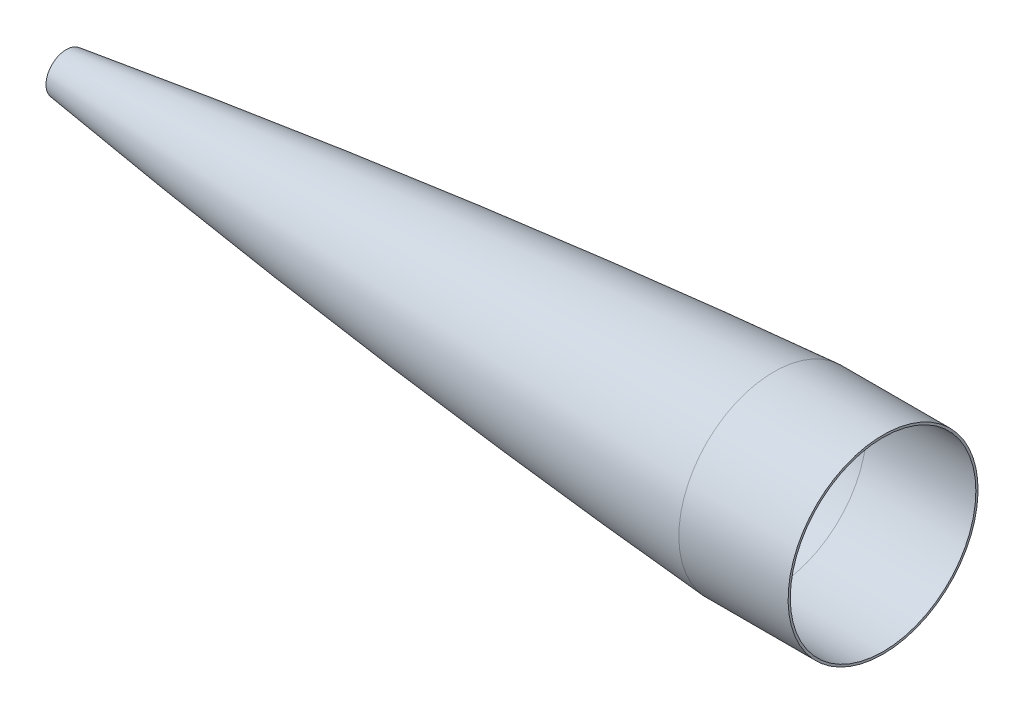
ISO-10303-21;
HEADER;
FILE_DESCRIPTION(('STEP AP214'),'2;1');
FILE_NAME('part.step','',(''),(''),'','','');
FILE_SCHEMA(('AUTOMOTIVE_DESIGN { 1 0 10303 214 1 1 1 1 }'));
ENDSEC;
DATA;
#1=APPLICATION_CONTEXT('core data for automotive mechanical design processes');
#2=APPLICATION_PROTOCOL_DEFINITION('international standard','automotive_design',2000,#1);
#3=PRODUCT_CONTEXT('',#1,'mechanical');
#4=PRODUCT('Part','Part','',(#3));
#5=PRODUCT_RELATED_PRODUCT_CATEGORY('part','',(#4));
#6=PRODUCT_DEFINITION_FORMATION('','',#4);
#7=PRODUCT_DEFINITION_CONTEXT('part definition',#1,'design');
#8=PRODUCT_DEFINITION('design','',#6,#7);
#9=PRODUCT_DEFINITION_SHAPE('','',#8);
#10=(LENGTH_UNIT() NAMED_UNIT(*) SI_UNIT(.MILLI.,.METRE.));
#11=(NAMED_UNIT(*) PLANE_ANGLE_UNIT() SI_UNIT($,.RADIAN.));
#12=(NAMED_UNIT(*) SI_UNIT($,.STERADIAN.) SOLID_ANGLE_UNIT());
#13=UNCERTAINTY_MEASURE_WITH_UNIT(LENGTH_MEASURE(1.E-05),#10,'distance_accuracy_value','');
#14=(GEOMETRIC_REPRESENTATION_CONTEXT(3) GLOBAL_UNCERTAINTY_ASSIGNED_CONTEXT((#13)) GLOBAL_UNIT_ASSIGNED_CONTEXT((#10,
#11,#12)) REPRESENTATION_CONTEXT('',''));
#15=CARTESIAN_POINT('',(0.,0.,0.));
#16=DIRECTION('',(0.,0.,1.));
#17=DIRECTION('',(1.,0.,0.));
#18=AXIS2_PLACEMENT_3D('',#15,#16,#17);
#19=CARTESIAN_POINT('',(1520.67256201447,-1.35003119794419E-10,-3.01020237672489E-12));
#20=DIRECTION('',(-1.,0.,0.));
#21=DIRECTION('',(0.,-1.,0.));
#22=AXIS2_PLACEMENT_3D('',#19,#20,#21);
#23=DEGENERATE_TOROIDAL_SURFACE('',#22,10185.3460356525,10300.2386312827,.F.);
#24=CARTESIAN_POINT('',(763.161647781223,-6.77205898236431E-11,-1.5106940595634E-12));
#25=DIRECTION('',(-1.,0.,0.));
#26=DIRECTION('',(0.,-1.,0.));
#27=AXIS2_PLACEMENT_3D('',#24,#25,#26);
#28=CIRCLE('',#27,87.);
#29=CARTESIAN_POINT('',(763.161647781215,-87.0000000000677,-1.5106940595634E-12));
#30=VERTEX_POINT('',#29);
#31=EDGE_CURVE('E10',#30,#30,#28,.T.);
#32=ORIENTED_EDGE('',*,*,#31,.T.);
#33=EDGE_LOOP('',(#32));
#34=FACE_BOUND('',#33,.T.);
#35=CARTESIAN_POINT('',(114.997091285507,-1.33381922687368E-10,-3.01020237672489E-12));
#36=DIRECTION('',(-1.,0.,0.));
#37=DIRECTION('',(0.,-1.,0.));
#38=AXIS2_PLACEMENT_3D('',#35,#36,#37);
#39=CIRCLE('',#38,18.5254027947259);
#40=CARTESIAN_POINT('',(114.997091285507,-18.5254027948593,-3.01020237672489E-12));
#41=VERTEX_POINT('',#40);
#42=EDGE_CURVE('E61',#41,#41,#39,.F.);
#43=ORIENTED_EDGE('',*,*,#42,.T.);
#44=EDGE_LOOP('',(#43));
#45=FACE_BOUND('',#44,.T.);
#46=ADVANCED_FACE('F41',(#34,#45),#23,.F.);
#47=CARTESIAN_POINT('',(1520.67256201447,-1.35003119794419E-10,-3.01020237672489E-12));
#48=DIRECTION('',(-1.,0.,0.));
#49=DIRECTION('',(0.,-1.,0.));
#50=AXIS2_PLACEMENT_3D('',#47,#48,#49);
#51=DEGENERATE_TOROIDAL_SURFACE('',#50,10185.3460356525,10298.2386312827,.F.);
#52=CARTESIAN_POINT('',(763.235294117042,-6.77271249703115E-11,-1.51083984398844E-12));
#53=DIRECTION('',(-1.,0.,0.));
#54=DIRECTION('',(0.,-1.,0.));
#55=AXIS2_PLACEMENT_3D('',#52,#53,#54);
#56=CIRCLE('',#55,85.);
#57=CARTESIAN_POINT('',(763.235294117034,-85.0000000000677,-1.51083984398844E-12));
#58=VERTEX_POINT('',#57);
#59=EDGE_CURVE('E49',#58,#58,#56,.T.);
#60=ORIENTED_EDGE('',*,*,#59,.F.);
#61=EDGE_LOOP('',(#60));
#62=FACE_BOUND('',#61,.T.);
#63=CARTESIAN_POINT('',(114.997091285507,-1.33381922687368E-10,-3.01020237672489E-12));
#64=DIRECTION('',(-1.,0.,0.));
#65=DIRECTION('',(0.,-1.,0.));
#66=AXIS2_PLACEMENT_3D('',#63,#64,#65);
#67=CIRCLE('',#66,16.506510715466);
#68=CARTESIAN_POINT('',(114.997091285507,-16.5065107155994,-3.01020237672489E-12));
#69=VERTEX_POINT('',#68);
#70=EDGE_CURVE('E45',#69,#69,#67,.T.);
#71=ORIENTED_EDGE('',*,*,#70,.T.);
#72=EDGE_LOOP('',(#71));
#73=FACE_BOUND('',#72,.T.);
#74=ADVANCED_FACE('F43',(#62,#73),#51,.T.);
#75=CARTESIAN_POINT('',(763.235294117049,-6.77271249703122E-11,-1.51083984398845E-12));
#76=DIRECTION('',(-1.,0.,0.));
#77=DIRECTION('',(0.,-1.,0.));
#78=AXIS2_PLACEMENT_3D('',#75,#76,#77);
#79=CYLINDRICAL_SURFACE('',#78,87.);
#80=ORIENTED_EDGE('',*,*,#31,.F.);
#81=EDGE_LOOP('',(#80));
#82=FACE_BOUND('',#81,.T.);
#83=CARTESIAN_POINT('',(863.235294117108,0.,-1.70879188520494E-12));
#84=DIRECTION('',(-1.,-6.77148785023207E-13,0.));
#85=DIRECTION('',(6.77148785023207E-13,-1.,0.));
#86=AXIS2_PLACEMENT_3D('',#83,#84,#85);
#87=CIRCLE('',#86,86.9999999999323);
#88=CARTESIAN_POINT('',(863.235294117167,-86.9999999999323,-1.70879188520494E-12));
#89=VERTEX_POINT('',#88);
#90=EDGE_CURVE('E53',#89,#89,#87,.T.);
#91=ORIENTED_EDGE('',*,*,#90,.T.);
#92=EDGE_LOOP('',(#91));
#93=FACE_BOUND('',#92,.T.);
#94=ADVANCED_FACE('F85',(#82,#93),#79,.T.);
#95=CARTESIAN_POINT('',(863.235294117049,86.9999999999322,-1.70879188520482E-12));
#96=DIRECTION('',(1.,6.77148785023207E-13,0.));
#97=DIRECTION('',(-6.77148785023207E-13,1.,0.));
#98=AXIS2_PLACEMENT_3D('',#95,#96,#97);
#99=PLANE('',#98);
#100=CARTESIAN_POINT('',(863.235294117107,0.,-1.70879188520494E-12));
#101=DIRECTION('',(-1.,-6.77148785023207E-13,0.));
#102=DIRECTION('',(6.77148785023207E-13,-1.,0.));
#103=AXIS2_PLACEMENT_3D('',#100,#101,#102);
#104=CIRCLE('',#103,84.9999999999323);
#105=CARTESIAN_POINT('',(863.235294117164,-84.9999999999323,-1.70879188520494E-12));
#106=VERTEX_POINT('',#105);
#107=EDGE_CURVE('E58',#106,#106,#104,.T.);
#108=ORIENTED_EDGE('',*,*,#107,.T.);
#109=EDGE_LOOP('',(#108));
#110=FACE_BOUND('',#109,.T.);
#111=ORIENTED_EDGE('',*,*,#90,.F.);
#112=EDGE_LOOP('',(#111));
#113=FACE_BOUND('',#112,.T.);
#114=ADVANCED_FACE('F78',(#110,#113),#99,.T.);
#115=CARTESIAN_POINT('',(763.235294117049,-6.77271249703122E-11,-1.51083984398845E-12));
#116=DIRECTION('',(-1.,0.,0.));
#117=DIRECTION('',(0.,-1.,0.));
#118=AXIS2_PLACEMENT_3D('',#115,#116,#117);
#119=CYLINDRICAL_SURFACE('',#118,85.);
#120=ORIENTED_EDGE('',*,*,#59,.T.);
#121=EDGE_LOOP('',(#120));
#122=FACE_BOUND('',#121,.T.);
#123=ORIENTED_EDGE('',*,*,#107,.F.);
#124=EDGE_LOOP('',(#123));
#125=FACE_BOUND('',#124,.T.);
#126=ADVANCED_FACE('F71',(#122,#125),#119,.F.);
#127=CARTESIAN_POINT('',(114.997091285508,-1.32628729456758E-13,50.));
#128=DIRECTION('',(-1.,0.,0.));
#129=DIRECTION('',(0.,-1.,0.));
#130=AXIS2_PLACEMENT_3D('',#127,#128,#129);
#131=PLANE('',#130);
#132=ORIENTED_EDGE('',*,*,#42,.F.);
#133=EDGE_LOOP('',(#132));
#134=FACE_BOUND('',#133,.T.);
#135=ORIENTED_EDGE('',*,*,#70,.F.);
#136=EDGE_LOOP('',(#135));
#137=FACE_BOUND('',#136,.T.);
#138=ADVANCED_FACE('F69',(#134,#137),#131,.T.);
#139=CLOSED_SHELL('',(#46,#74,#94,#114,#126,#138));
#140=MANIFOLD_SOLID_BREP('B2',#139);
#141=ADVANCED_BREP_SHAPE_REPRESENTATION('',(#18,#140),#14);
#142=SHAPE_DEFINITION_REPRESENTATION(#9,#141);
ENDSEC;
END-ISO-10303-21;
